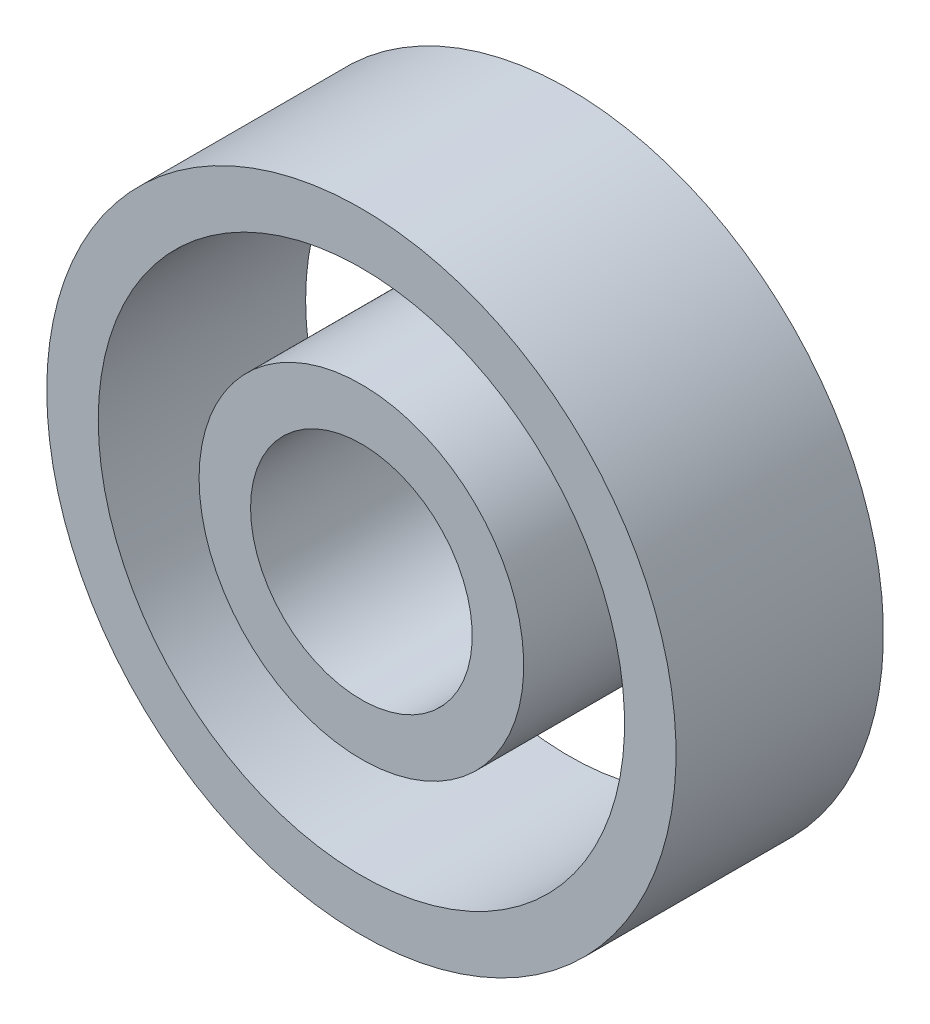
ISO-10303-21;
HEADER;
FILE_DESCRIPTION(('STEP AP214'),'2;1');
FILE_NAME('part.step','',(''),(''),'','','');
FILE_SCHEMA(('AUTOMOTIVE_DESIGN { 1 0 10303 214 1 1 1 1 }'));
ENDSEC;
DATA;
#1=APPLICATION_CONTEXT('core data for automotive mechanical design processes');
#2=APPLICATION_PROTOCOL_DEFINITION('international standard','automotive_design',2000,#1);
#3=PRODUCT_CONTEXT('',#1,'mechanical');
#4=PRODUCT('Part','Part','',(#3));
#5=PRODUCT_RELATED_PRODUCT_CATEGORY('part','',(#4));
#6=PRODUCT_DEFINITION_FORMATION('','',#4);
#7=PRODUCT_DEFINITION_CONTEXT('part definition',#1,'design');
#8=PRODUCT_DEFINITION('design','',#6,#7);
#9=PRODUCT_DEFINITION_SHAPE('','',#8);
#10=(LENGTH_UNIT() NAMED_UNIT(*) SI_UNIT(.MILLI.,.METRE.));
#11=(NAMED_UNIT(*) PLANE_ANGLE_UNIT() SI_UNIT($,.RADIAN.));
#12=(NAMED_UNIT(*) SI_UNIT($,.STERADIAN.) SOLID_ANGLE_UNIT());
#13=UNCERTAINTY_MEASURE_WITH_UNIT(LENGTH_MEASURE(1.E-05),#10,'distance_accuracy_value','');
#14=(GEOMETRIC_REPRESENTATION_CONTEXT(3) GLOBAL_UNCERTAINTY_ASSIGNED_CONTEXT((#13)) GLOBAL_UNIT_ASSIGNED_CONTEXT((#10,
#11,#12)) REPRESENTATION_CONTEXT('',''));
#15=CARTESIAN_POINT('',(0.,0.,0.));
#16=DIRECTION('',(0.,0.,1.));
#17=DIRECTION('',(1.,0.,0.));
#18=AXIS2_PLACEMENT_3D('',#15,#16,#17);
#19=CARTESIAN_POINT('',(0.,0.,7.25));
#20=DIRECTION('',(0.,0.,-1.));
#21=DIRECTION('',(-1.,0.,0.));
#22=AXIS2_PLACEMENT_3D('',#19,#20,#21);
#23=CYLINDRICAL_SURFACE('',#22,3.875);
#24=CARTESIAN_POINT('',(0.,0.,7.25));
#25=DIRECTION('',(0.,0.,1.));
#26=DIRECTION('',(1.,0.,0.));
#27=AXIS2_PLACEMENT_3D('',#24,#25,#26);
#28=CIRCLE('',#27,3.875);
#29=CARTESIAN_POINT('',(-3.875,0.,7.25));
#30=VERTEX_POINT('',#29);
#31=EDGE_CURVE('E60',#30,#30,#28,.T.);
#32=CARTESIAN_POINT('',(0.,0.,0.));
#33=DIRECTION('',(0.,0.,1.));
#34=DIRECTION('',(1.,0.,0.));
#35=AXIS2_PLACEMENT_3D('',#32,#33,#34);
#36=CIRCLE('',#35,3.875);
#37=CARTESIAN_POINT('',(-3.875,0.,0.));
#38=VERTEX_POINT('',#37);
#39=EDGE_CURVE('E66',#38,#38,#36,.T.);
#40=CARTESIAN_POINT('',(-3.875,0.,7.25));
#41=CARTESIAN_POINT('',(-3.875,0.,7.17447916666667));
#42=CARTESIAN_POINT('',(-3.875,0.,7.09895833333333));
#43=CARTESIAN_POINT('',(-3.875,0.,6.94791666666667));
#44=CARTESIAN_POINT('',(-3.875,0.,6.87239583333333));
#45=CARTESIAN_POINT('',(-3.875,0.,6.72135416666667));
#46=CARTESIAN_POINT('',(-3.875,0.,6.64583333333333));
#47=CARTESIAN_POINT('',(-3.875,0.,6.49479166666667));
#48=CARTESIAN_POINT('',(-3.875,0.,6.41927083333333));
#49=CARTESIAN_POINT('',(-3.875,0.,6.26822916666667));
#50=CARTESIAN_POINT('',(-3.875,0.,6.19270833333333));
#51=CARTESIAN_POINT('',(-3.875,0.,6.04166666666667));
#52=CARTESIAN_POINT('',(-3.875,0.,5.96614583333333));
#53=CARTESIAN_POINT('',(-3.875,0.,5.81510416666667));
#54=CARTESIAN_POINT('',(-3.875,0.,5.73958333333333));
#55=CARTESIAN_POINT('',(-3.875,0.,5.58854166666667));
#56=CARTESIAN_POINT('',(-3.875,0.,5.51302083333333));
#57=CARTESIAN_POINT('',(-3.875,0.,5.36197916666667));
#58=CARTESIAN_POINT('',(-3.875,0.,5.28645833333333));
#59=CARTESIAN_POINT('',(-3.875,0.,5.13541666666667));
#60=CARTESIAN_POINT('',(-3.875,0.,5.05989583333333));
#61=CARTESIAN_POINT('',(-3.875,0.,4.90885416666667));
#62=CARTESIAN_POINT('',(-3.875,0.,4.83333333333333));
#63=CARTESIAN_POINT('',(-3.875,0.,4.68229166666667));
#64=CARTESIAN_POINT('',(-3.875,0.,4.60677083333333));
#65=CARTESIAN_POINT('',(-3.875,0.,4.45572916666667));
#66=CARTESIAN_POINT('',(-3.875,0.,4.38020833333333));
#67=CARTESIAN_POINT('',(-3.875,0.,4.22916666666667));
#68=CARTESIAN_POINT('',(-3.875,0.,4.15364583333333));
#69=CARTESIAN_POINT('',(-3.875,0.,4.00260416666667));
#70=CARTESIAN_POINT('',(-3.875,0.,3.92708333333333));
#71=CARTESIAN_POINT('',(-3.875,0.,3.77604166666667));
#72=CARTESIAN_POINT('',(-3.875,0.,3.70052083333333));
#73=CARTESIAN_POINT('',(-3.875,0.,3.54947916666667));
#74=CARTESIAN_POINT('',(-3.875,0.,3.47395833333333));
#75=CARTESIAN_POINT('',(-3.875,0.,3.32291666666667));
#76=CARTESIAN_POINT('',(-3.875,0.,3.24739583333333));
#77=CARTESIAN_POINT('',(-3.875,0.,3.09635416666667));
#78=CARTESIAN_POINT('',(-3.875,0.,3.02083333333333));
#79=CARTESIAN_POINT('',(-3.875,0.,2.86979166666667));
#80=CARTESIAN_POINT('',(-3.875,0.,2.79427083333333));
#81=CARTESIAN_POINT('',(-3.875,0.,2.64322916666667));
#82=CARTESIAN_POINT('',(-3.875,0.,2.56770833333333));
#83=CARTESIAN_POINT('',(-3.875,0.,2.41666666666667));
#84=CARTESIAN_POINT('',(-3.875,0.,2.34114583333333));
#85=CARTESIAN_POINT('',(-3.875,0.,2.19010416666667));
#86=CARTESIAN_POINT('',(-3.875,0.,2.11458333333333));
#87=CARTESIAN_POINT('',(-3.875,0.,1.96354166666667));
#88=CARTESIAN_POINT('',(-3.875,0.,1.88802083333333));
#89=CARTESIAN_POINT('',(-3.875,0.,1.73697916666667));
#90=CARTESIAN_POINT('',(-3.875,0.,1.66145833333333));
#91=CARTESIAN_POINT('',(-3.875,0.,1.51041666666667));
#92=CARTESIAN_POINT('',(-3.875,0.,1.43489583333333));
#93=CARTESIAN_POINT('',(-3.875,0.,1.28385416666667));
#94=CARTESIAN_POINT('',(-3.875,0.,1.20833333333333));
#95=CARTESIAN_POINT('',(-3.875,0.,1.05729166666667));
#96=CARTESIAN_POINT('',(-3.875,0.,0.981770833333333));
#97=CARTESIAN_POINT('',(-3.875,0.,0.830729166666667));
#98=CARTESIAN_POINT('',(-3.875,0.,0.755208333333333));
#99=CARTESIAN_POINT('',(-3.875,0.,0.604166666666667));
#100=CARTESIAN_POINT('',(-3.875,0.,0.528645833333333));
#101=CARTESIAN_POINT('',(-3.875,0.,0.377604166666667));
#102=CARTESIAN_POINT('',(-3.875,0.,0.302083333333334));
#103=CARTESIAN_POINT('',(-3.875,0.,0.151041666666667));
#104=CARTESIAN_POINT('',(-3.875,0.,0.0755208333333333));
#105=CARTESIAN_POINT('',(-3.875,0.,0.));
#106=B_SPLINE_CURVE_WITH_KNOTS('',3,(#40,#41,#42,#43,#44,#45,#46,#47,#48,#49,#50,#51,#52,#53,
#54,#55,#56,#57,#58,#59,#60,#61,#62,#63,#64,#65,#66,#67,#68,#69,#70,#71,#72,#73,#74,#75,#76,#77,
#78,#79,#80,#81,#82,#83,#84,#85,#86,#87,#88,#89,#90,#91,#92,#93,#94,#95,#96,#97,#98,#99,#100,
#101,#102,#103,#104,#105),.UNSPECIFIED.,.F.,.F.,(4,2,2,2,2,2,2,2,2,2,2,2,2,2,2,2,2,2,2,2,2,2,2,
2,2,2,2,2,2,2,2,2,4),(0.,0.226562499999999,0.453125,0.6796875,0.906249999999999,1.1328125,
1.359375,1.5859375,1.8125,2.0390625,2.265625,2.4921875,2.71875,2.9453125,3.171875,3.3984375,
3.625,3.8515625,4.078125,4.3046875,4.53125,4.7578125,4.984375,5.2109375,5.4375,5.6640625,
5.890625,6.1171875,6.34375,6.5703125,6.796875,7.0234375,7.25),.UNSPECIFIED.);
#107=EDGE_CURVE('BSEAM53',#30,#38,#106,.T.);
#108=ORIENTED_EDGE('',*,*,#31,.T.);
#109=ORIENTED_EDGE('',*,*,#39,.F.);
#110=ORIENTED_EDGE('',*,*,#107,.T.);
#111=ORIENTED_EDGE('',*,*,#107,.F.);
#112=EDGE_LOOP('',(#108,#110,#109,#111));
#113=FACE_BOUND('',#112,.T.);
#114=ADVANCED_FACE('F53',(#113),#23,.F.);
#115=CARTESIAN_POINT('',(0.,0.,7.25));
#116=DIRECTION('',(0.,0.,-1.));
#117=DIRECTION('',(-1.,0.,0.));
#118=AXIS2_PLACEMENT_3D('',#115,#116,#117);
#119=CYLINDRICAL_SURFACE('',#118,5.675);
#120=CARTESIAN_POINT('',(0.,0.,7.25));
#121=DIRECTION('',(0.,0.,1.));
#122=DIRECTION('',(1.,0.,0.));
#123=AXIS2_PLACEMENT_3D('',#120,#121,#122);
#124=CIRCLE('',#123,5.675);
#125=CARTESIAN_POINT('',(-5.675,0.,7.25));
#126=VERTEX_POINT('',#125);
#127=EDGE_CURVE('E12',#126,#126,#124,.T.);
#128=CARTESIAN_POINT('',(0.,0.,0.));
#129=DIRECTION('',(0.,0.,1.));
#130=DIRECTION('',(1.,0.,0.));
#131=AXIS2_PLACEMENT_3D('',#128,#129,#130);
#132=CIRCLE('',#131,5.675);
#133=CARTESIAN_POINT('',(-5.675,0.,0.));
#134=VERTEX_POINT('',#133);
#135=EDGE_CURVE('E56',#134,#134,#132,.T.);
#136=CARTESIAN_POINT('',(-5.675,0.,7.25));
#137=CARTESIAN_POINT('',(-5.675,0.,7.17447916666667));
#138=CARTESIAN_POINT('',(-5.675,0.,7.09895833333333));
#139=CARTESIAN_POINT('',(-5.675,0.,6.94791666666667));
#140=CARTESIAN_POINT('',(-5.675,0.,6.87239583333333));
#141=CARTESIAN_POINT('',(-5.675,0.,6.72135416666667));
#142=CARTESIAN_POINT('',(-5.675,0.,6.64583333333333));
#143=CARTESIAN_POINT('',(-5.675,0.,6.49479166666667));
#144=CARTESIAN_POINT('',(-5.675,0.,6.41927083333333));
#145=CARTESIAN_POINT('',(-5.675,0.,6.26822916666667));
#146=CARTESIAN_POINT('',(-5.675,0.,6.19270833333333));
#147=CARTESIAN_POINT('',(-5.675,0.,6.04166666666667));
#148=CARTESIAN_POINT('',(-5.675,0.,5.96614583333333));
#149=CARTESIAN_POINT('',(-5.675,0.,5.81510416666667));
#150=CARTESIAN_POINT('',(-5.675,0.,5.73958333333333));
#151=CARTESIAN_POINT('',(-5.675,0.,5.58854166666667));
#152=CARTESIAN_POINT('',(-5.675,0.,5.51302083333333));
#153=CARTESIAN_POINT('',(-5.675,0.,5.36197916666667));
#154=CARTESIAN_POINT('',(-5.675,0.,5.28645833333333));
#155=CARTESIAN_POINT('',(-5.675,0.,5.13541666666667));
#156=CARTESIAN_POINT('',(-5.675,0.,5.05989583333333));
#157=CARTESIAN_POINT('',(-5.675,0.,4.90885416666667));
#158=CARTESIAN_POINT('',(-5.675,0.,4.83333333333333));
#159=CARTESIAN_POINT('',(-5.675,0.,4.68229166666667));
#160=CARTESIAN_POINT('',(-5.675,0.,4.60677083333333));
#161=CARTESIAN_POINT('',(-5.675,0.,4.45572916666667));
#162=CARTESIAN_POINT('',(-5.675,0.,4.38020833333333));
#163=CARTESIAN_POINT('',(-5.675,0.,4.22916666666667));
#164=CARTESIAN_POINT('',(-5.675,0.,4.15364583333333));
#165=CARTESIAN_POINT('',(-5.675,0.,4.00260416666667));
#166=CARTESIAN_POINT('',(-5.675,0.,3.92708333333333));
#167=CARTESIAN_POINT('',(-5.675,0.,3.77604166666667));
#168=CARTESIAN_POINT('',(-5.675,0.,3.70052083333333));
#169=CARTESIAN_POINT('',(-5.675,0.,3.54947916666667));
#170=CARTESIAN_POINT('',(-5.675,0.,3.47395833333333));
#171=CARTESIAN_POINT('',(-5.675,0.,3.32291666666667));
#172=CARTESIAN_POINT('',(-5.675,0.,3.24739583333333));
#173=CARTESIAN_POINT('',(-5.675,0.,3.09635416666667));
#174=CARTESIAN_POINT('',(-5.675,0.,3.02083333333333));
#175=CARTESIAN_POINT('',(-5.675,0.,2.86979166666667));
#176=CARTESIAN_POINT('',(-5.675,0.,2.79427083333333));
#177=CARTESIAN_POINT('',(-5.675,0.,2.64322916666667));
#178=CARTESIAN_POINT('',(-5.675,0.,2.56770833333333));
#179=CARTESIAN_POINT('',(-5.675,0.,2.41666666666667));
#180=CARTESIAN_POINT('',(-5.675,0.,2.34114583333333));
#181=CARTESIAN_POINT('',(-5.675,0.,2.19010416666667));
#182=CARTESIAN_POINT('',(-5.675,0.,2.11458333333333));
#183=CARTESIAN_POINT('',(-5.675,0.,1.96354166666667));
#184=CARTESIAN_POINT('',(-5.675,0.,1.88802083333333));
#185=CARTESIAN_POINT('',(-5.675,0.,1.73697916666667));
#186=CARTESIAN_POINT('',(-5.675,0.,1.66145833333333));
#187=CARTESIAN_POINT('',(-5.675,0.,1.51041666666667));
#188=CARTESIAN_POINT('',(-5.675,0.,1.43489583333333));
#189=CARTESIAN_POINT('',(-5.675,0.,1.28385416666667));
#190=CARTESIAN_POINT('',(-5.675,0.,1.20833333333333));
#191=CARTESIAN_POINT('',(-5.675,0.,1.05729166666667));
#192=CARTESIAN_POINT('',(-5.675,0.,0.981770833333333));
#193=CARTESIAN_POINT('',(-5.675,0.,0.830729166666667));
#194=CARTESIAN_POINT('',(-5.675,0.,0.755208333333333));
#195=CARTESIAN_POINT('',(-5.675,0.,0.604166666666667));
#196=CARTESIAN_POINT('',(-5.675,0.,0.528645833333333));
#197=CARTESIAN_POINT('',(-5.675,0.,0.377604166666667));
#198=CARTESIAN_POINT('',(-5.675,0.,0.302083333333334));
#199=CARTESIAN_POINT('',(-5.675,0.,0.151041666666667));
#200=CARTESIAN_POINT('',(-5.675,0.,0.0755208333333333));
#201=CARTESIAN_POINT('',(-5.675,0.,0.));
#202=B_SPLINE_CURVE_WITH_KNOTS('',3,(#136,#137,#138,#139,#140,#141,#142,#143,#144,#145,#146,
#147,#148,#149,#150,#151,#152,#153,#154,#155,#156,#157,#158,#159,#160,#161,#162,#163,#164,#165,
#166,#167,#168,#169,#170,#171,#172,#173,#174,#175,#176,#177,#178,#179,#180,#181,#182,#183,#184,
#185,#186,#187,#188,#189,#190,#191,#192,#193,#194,#195,#196,#197,#198,#199,#200,#201),
.UNSPECIFIED.,.F.,.F.,(4,2,2,2,2,2,2,2,2,2,2,2,2,2,2,2,2,2,2,2,2,2,2,2,2,2,2,2,2,2,2,2,4),(0.,
0.226562499999999,0.453125,0.6796875,0.906249999999999,1.1328125,1.359375,1.5859375,1.8125,
2.0390625,2.265625,2.4921875,2.71875,2.9453125,3.171875,3.3984375,3.625,3.8515625,4.078125,
4.3046875,4.53125,4.7578125,4.984375,5.2109375,5.4375,5.6640625,5.890625,6.1171875,6.34375,
6.5703125,6.796875,7.0234375,7.25),.UNSPECIFIED.);
#203=EDGE_CURVE('BSEAM73',#126,#134,#202,.T.);
#204=ORIENTED_EDGE('',*,*,#127,.F.);
#205=ORIENTED_EDGE('',*,*,#135,.T.);
#206=ORIENTED_EDGE('',*,*,#203,.T.);
#207=ORIENTED_EDGE('',*,*,#203,.F.);
#208=EDGE_LOOP('',(#204,#206,#205,#207));
#209=FACE_BOUND('',#208,.T.);
#210=ADVANCED_FACE('F73',(#209),#119,.T.);
#211=CARTESIAN_POINT('',(0.,0.,7.25));
#212=DIRECTION('',(0.,0.,1.));
#213=DIRECTION('',(1.,0.,0.));
#214=AXIS2_PLACEMENT_3D('',#211,#212,#213);
#215=PLANE('',#214);
#216=ORIENTED_EDGE('',*,*,#31,.F.);
#217=EDGE_LOOP('',(#216));
#218=FACE_BOUND('',#217,.T.);
#219=ORIENTED_EDGE('',*,*,#127,.T.);
#220=EDGE_LOOP('',(#219));
#221=FACE_BOUND('',#220,.T.);
#222=ADVANCED_FACE('F77',(#218,#221),#215,.T.);
#223=CARTESIAN_POINT('',(0.,0.,0.));
#224=DIRECTION('',(0.,0.,1.));
#225=DIRECTION('',(1.,0.,0.));
#226=AXIS2_PLACEMENT_3D('',#223,#224,#225);
#227=PLANE('',#226);
#228=ORIENTED_EDGE('',*,*,#39,.T.);
#229=EDGE_LOOP('',(#228));
#230=FACE_BOUND('',#229,.T.);
#231=ORIENTED_EDGE('',*,*,#135,.F.);
#232=EDGE_LOOP('',(#231));
#233=FACE_BOUND('',#232,.T.);
#234=ADVANCED_FACE('F75',(#230,#233),#227,.F.);
#235=CLOSED_SHELL('',(#114,#210,#222,#234));
#236=MANIFOLD_SOLID_BREP('B2',#235);
#237=CARTESIAN_POINT('',(0.,0.,7.25));
#238=DIRECTION('',(0.,0.,-1.));
#239=DIRECTION('',(-1.,0.,0.));
#240=AXIS2_PLACEMENT_3D('',#237,#238,#239);
#241=CYLINDRICAL_SURFACE('',#240,9.2);
#242=CARTESIAN_POINT('',(0.,0.,7.25));
#243=DIRECTION('',(0.,0.,1.));
#244=DIRECTION('',(1.,0.,0.));
#245=AXIS2_PLACEMENT_3D('',#242,#243,#244);
#246=CIRCLE('',#245,9.2);
#247=CARTESIAN_POINT('',(-9.2,0.,7.25));
#248=VERTEX_POINT('',#247);
#249=EDGE_CURVE('E123',#248,#248,#246,.T.);
#250=CARTESIAN_POINT('',(0.,0.,0.));
#251=DIRECTION('',(0.,0.,1.));
#252=DIRECTION('',(1.,0.,0.));
#253=AXIS2_PLACEMENT_3D('',#250,#251,#252);
#254=CIRCLE('',#253,9.2);
#255=CARTESIAN_POINT('',(-9.2,0.,0.));
#256=VERTEX_POINT('',#255);
#257=EDGE_CURVE('E130',#256,#256,#254,.T.);
#258=CARTESIAN_POINT('',(-9.2,0.,7.25));
#259=CARTESIAN_POINT('',(-9.2,0.,7.17447916666667));
#260=CARTESIAN_POINT('',(-9.2,0.,7.09895833333333));
#261=CARTESIAN_POINT('',(-9.2,0.,6.94791666666667));
#262=CARTESIAN_POINT('',(-9.2,0.,6.87239583333333));
#263=CARTESIAN_POINT('',(-9.2,0.,6.72135416666667));
#264=CARTESIAN_POINT('',(-9.2,0.,6.64583333333333));
#265=CARTESIAN_POINT('',(-9.2,0.,6.49479166666667));
#266=CARTESIAN_POINT('',(-9.2,0.,6.41927083333333));
#267=CARTESIAN_POINT('',(-9.2,0.,6.26822916666667));
#268=CARTESIAN_POINT('',(-9.2,0.,6.19270833333333));
#269=CARTESIAN_POINT('',(-9.2,0.,6.04166666666667));
#270=CARTESIAN_POINT('',(-9.2,0.,5.96614583333333));
#271=CARTESIAN_POINT('',(-9.2,0.,5.81510416666667));
#272=CARTESIAN_POINT('',(-9.2,0.,5.73958333333333));
#273=CARTESIAN_POINT('',(-9.2,0.,5.58854166666667));
#274=CARTESIAN_POINT('',(-9.2,0.,5.51302083333333));
#275=CARTESIAN_POINT('',(-9.2,0.,5.36197916666667));
#276=CARTESIAN_POINT('',(-9.2,0.,5.28645833333333));
#277=CARTESIAN_POINT('',(-9.2,0.,5.13541666666667));
#278=CARTESIAN_POINT('',(-9.2,0.,5.05989583333333));
#279=CARTESIAN_POINT('',(-9.2,0.,4.90885416666667));
#280=CARTESIAN_POINT('',(-9.2,0.,4.83333333333333));
#281=CARTESIAN_POINT('',(-9.2,0.,4.68229166666667));
#282=CARTESIAN_POINT('',(-9.2,0.,4.60677083333333));
#283=CARTESIAN_POINT('',(-9.2,0.,4.45572916666667));
#284=CARTESIAN_POINT('',(-9.2,0.,4.38020833333333));
#285=CARTESIAN_POINT('',(-9.2,0.,4.22916666666667));
#286=CARTESIAN_POINT('',(-9.2,0.,4.15364583333333));
#287=CARTESIAN_POINT('',(-9.2,0.,4.00260416666667));
#288=CARTESIAN_POINT('',(-9.2,0.,3.92708333333333));
#289=CARTESIAN_POINT('',(-9.2,0.,3.77604166666667));
#290=CARTESIAN_POINT('',(-9.2,0.,3.70052083333333));
#291=CARTESIAN_POINT('',(-9.2,0.,3.54947916666667));
#292=CARTESIAN_POINT('',(-9.2,0.,3.47395833333333));
#293=CARTESIAN_POINT('',(-9.2,0.,3.32291666666667));
#294=CARTESIAN_POINT('',(-9.2,0.,3.24739583333333));
#295=CARTESIAN_POINT('',(-9.2,0.,3.09635416666667));
#296=CARTESIAN_POINT('',(-9.2,0.,3.02083333333333));
#297=CARTESIAN_POINT('',(-9.2,0.,2.86979166666667));
#298=CARTESIAN_POINT('',(-9.2,0.,2.79427083333333));
#299=CARTESIAN_POINT('',(-9.2,0.,2.64322916666667));
#300=CARTESIAN_POINT('',(-9.2,0.,2.56770833333333));
#301=CARTESIAN_POINT('',(-9.2,0.,2.41666666666667));
#302=CARTESIAN_POINT('',(-9.2,0.,2.34114583333333));
#303=CARTESIAN_POINT('',(-9.2,0.,2.19010416666667));
#304=CARTESIAN_POINT('',(-9.2,0.,2.11458333333333));
#305=CARTESIAN_POINT('',(-9.2,0.,1.96354166666667));
#306=CARTESIAN_POINT('',(-9.2,0.,1.88802083333333));
#307=CARTESIAN_POINT('',(-9.2,0.,1.73697916666667));
#308=CARTESIAN_POINT('',(-9.2,0.,1.66145833333333));
#309=CARTESIAN_POINT('',(-9.2,0.,1.51041666666667));
#310=CARTESIAN_POINT('',(-9.2,0.,1.43489583333333));
#311=CARTESIAN_POINT('',(-9.2,0.,1.28385416666667));
#312=CARTESIAN_POINT('',(-9.2,0.,1.20833333333333));
#313=CARTESIAN_POINT('',(-9.2,0.,1.05729166666667));
#314=CARTESIAN_POINT('',(-9.2,0.,0.981770833333333));
#315=CARTESIAN_POINT('',(-9.2,0.,0.830729166666667));
#316=CARTESIAN_POINT('',(-9.2,0.,0.755208333333333));
#317=CARTESIAN_POINT('',(-9.2,0.,0.604166666666667));
#318=CARTESIAN_POINT('',(-9.2,0.,0.528645833333333));
#319=CARTESIAN_POINT('',(-9.2,0.,0.377604166666667));
#320=CARTESIAN_POINT('',(-9.2,0.,0.302083333333334));
#321=CARTESIAN_POINT('',(-9.2,0.,0.151041666666667));
#322=CARTESIAN_POINT('',(-9.2,0.,0.0755208333333333));
#323=CARTESIAN_POINT('',(-9.2,0.,0.));
#324=B_SPLINE_CURVE_WITH_KNOTS('',3,(#258,#259,#260,#261,#262,#263,#264,#265,#266,#267,#268,
#269,#270,#271,#272,#273,#274,#275,#276,#277,#278,#279,#280,#281,#282,#283,#284,#285,#286,#287,
#288,#289,#290,#291,#292,#293,#294,#295,#296,#297,#298,#299,#300,#301,#302,#303,#304,#305,#306,
#307,#308,#309,#310,#311,#312,#313,#314,#315,#316,#317,#318,#319,#320,#321,#322,#323),
.UNSPECIFIED.,.F.,.F.,(4,2,2,2,2,2,2,2,2,2,2,2,2,2,2,2,2,2,2,2,2,2,2,2,2,2,2,2,2,2,2,2,4),(0.,
0.226562499999999,0.453125,0.6796875,0.906249999999999,1.1328125,1.359375,1.5859375,1.8125,
2.0390625,2.265625,2.4921875,2.71875,2.9453125,3.171875,3.3984375,3.625,3.8515625,4.078125,
4.3046875,4.53125,4.7578125,4.984375,5.2109375,5.4375,5.6640625,5.890625,6.1171875,6.34375,
6.5703125,6.796875,7.0234375,7.25),.UNSPECIFIED.);
#325=EDGE_CURVE('BSEAM115',#248,#256,#324,.T.);
#326=ORIENTED_EDGE('',*,*,#249,.T.);
#327=ORIENTED_EDGE('',*,*,#257,.F.);
#328=ORIENTED_EDGE('',*,*,#325,.T.);
#329=ORIENTED_EDGE('',*,*,#325,.F.);
#330=EDGE_LOOP('',(#326,#328,#327,#329));
#331=FACE_BOUND('',#330,.T.);
#332=ADVANCED_FACE('F115',(#331),#241,.F.);
#333=CARTESIAN_POINT('',(0.,0.,7.25));
#334=DIRECTION('',(0.,0.,-1.));
#335=DIRECTION('',(-1.,0.,0.));
#336=AXIS2_PLACEMENT_3D('',#333,#334,#335);
#337=CYLINDRICAL_SURFACE('',#336,11.);
#338=CARTESIAN_POINT('',(0.,0.,7.25));
#339=DIRECTION('',(0.,0.,1.));
#340=DIRECTION('',(1.,0.,0.));
#341=AXIS2_PLACEMENT_3D('',#338,#339,#340);
#342=CIRCLE('',#341,11.);
#343=CARTESIAN_POINT('',(-11.,0.,7.25));
#344=VERTEX_POINT('',#343);
#345=EDGE_CURVE('E52',#344,#344,#342,.T.);
#346=CARTESIAN_POINT('',(0.,0.,0.));
#347=DIRECTION('',(0.,0.,1.));
#348=DIRECTION('',(1.,0.,0.));
#349=AXIS2_PLACEMENT_3D('',#346,#347,#348);
#350=CIRCLE('',#349,11.);
#351=CARTESIAN_POINT('',(-11.,0.,0.));
#352=VERTEX_POINT('',#351);
#353=EDGE_CURVE('E118',#352,#352,#350,.T.);
#354=CARTESIAN_POINT('',(-11.,0.,7.25));
#355=CARTESIAN_POINT('',(-11.,0.,7.17447916666667));
#356=CARTESIAN_POINT('',(-11.,0.,7.09895833333333));
#357=CARTESIAN_POINT('',(-11.,0.,6.94791666666667));
#358=CARTESIAN_POINT('',(-11.,0.,6.87239583333333));
#359=CARTESIAN_POINT('',(-11.,0.,6.72135416666667));
#360=CARTESIAN_POINT('',(-11.,0.,6.64583333333333));
#361=CARTESIAN_POINT('',(-11.,0.,6.49479166666667));
#362=CARTESIAN_POINT('',(-11.,0.,6.41927083333333));
#363=CARTESIAN_POINT('',(-11.,0.,6.26822916666667));
#364=CARTESIAN_POINT('',(-11.,0.,6.19270833333333));
#365=CARTESIAN_POINT('',(-11.,0.,6.04166666666667));
#366=CARTESIAN_POINT('',(-11.,0.,5.96614583333333));
#367=CARTESIAN_POINT('',(-11.,0.,5.81510416666667));
#368=CARTESIAN_POINT('',(-11.,0.,5.73958333333333));
#369=CARTESIAN_POINT('',(-11.,0.,5.58854166666667));
#370=CARTESIAN_POINT('',(-11.,0.,5.51302083333333));
#371=CARTESIAN_POINT('',(-11.,0.,5.36197916666667));
#372=CARTESIAN_POINT('',(-11.,0.,5.28645833333333));
#373=CARTESIAN_POINT('',(-11.,0.,5.13541666666667));
#374=CARTESIAN_POINT('',(-11.,0.,5.05989583333333));
#375=CARTESIAN_POINT('',(-11.,0.,4.90885416666667));
#376=CARTESIAN_POINT('',(-11.,0.,4.83333333333333));
#377=CARTESIAN_POINT('',(-11.,0.,4.68229166666667));
#378=CARTESIAN_POINT('',(-11.,0.,4.60677083333333));
#379=CARTESIAN_POINT('',(-11.,0.,4.45572916666667));
#380=CARTESIAN_POINT('',(-11.,0.,4.38020833333333));
#381=CARTESIAN_POINT('',(-11.,0.,4.22916666666667));
#382=CARTESIAN_POINT('',(-11.,0.,4.15364583333333));
#383=CARTESIAN_POINT('',(-11.,0.,4.00260416666667));
#384=CARTESIAN_POINT('',(-11.,0.,3.92708333333333));
#385=CARTESIAN_POINT('',(-11.,0.,3.77604166666667));
#386=CARTESIAN_POINT('',(-11.,0.,3.70052083333333));
#387=CARTESIAN_POINT('',(-11.,0.,3.54947916666667));
#388=CARTESIAN_POINT('',(-11.,0.,3.47395833333333));
#389=CARTESIAN_POINT('',(-11.,0.,3.32291666666667));
#390=CARTESIAN_POINT('',(-11.,0.,3.24739583333333));
#391=CARTESIAN_POINT('',(-11.,0.,3.09635416666667));
#392=CARTESIAN_POINT('',(-11.,0.,3.02083333333333));
#393=CARTESIAN_POINT('',(-11.,0.,2.86979166666667));
#394=CARTESIAN_POINT('',(-11.,0.,2.79427083333333));
#395=CARTESIAN_POINT('',(-11.,0.,2.64322916666667));
#396=CARTESIAN_POINT('',(-11.,0.,2.56770833333333));
#397=CARTESIAN_POINT('',(-11.,0.,2.41666666666667));
#398=CARTESIAN_POINT('',(-11.,0.,2.34114583333333));
#399=CARTESIAN_POINT('',(-11.,0.,2.19010416666667));
#400=CARTESIAN_POINT('',(-11.,0.,2.11458333333333));
#401=CARTESIAN_POINT('',(-11.,0.,1.96354166666667));
#402=CARTESIAN_POINT('',(-11.,0.,1.88802083333333));
#403=CARTESIAN_POINT('',(-11.,0.,1.73697916666667));
#404=CARTESIAN_POINT('',(-11.,0.,1.66145833333333));
#405=CARTESIAN_POINT('',(-11.,0.,1.51041666666667));
#406=CARTESIAN_POINT('',(-11.,0.,1.43489583333333));
#407=CARTESIAN_POINT('',(-11.,0.,1.28385416666667));
#408=CARTESIAN_POINT('',(-11.,0.,1.20833333333333));
#409=CARTESIAN_POINT('',(-11.,0.,1.05729166666667));
#410=CARTESIAN_POINT('',(-11.,0.,0.981770833333333));
#411=CARTESIAN_POINT('',(-11.,0.,0.830729166666667));
#412=CARTESIAN_POINT('',(-11.,0.,0.755208333333333));
#413=CARTESIAN_POINT('',(-11.,0.,0.604166666666667));
#414=CARTESIAN_POINT('',(-11.,0.,0.528645833333333));
#415=CARTESIAN_POINT('',(-11.,0.,0.377604166666667));
#416=CARTESIAN_POINT('',(-11.,0.,0.302083333333334));
#417=CARTESIAN_POINT('',(-11.,0.,0.151041666666667));
#418=CARTESIAN_POINT('',(-11.,0.,0.0755208333333333));
#419=CARTESIAN_POINT('',(-11.,0.,0.));
#420=B_SPLINE_CURVE_WITH_KNOTS('',3,(#354,#355,#356,#357,#358,#359,#360,#361,#362,#363,#364,
#365,#366,#367,#368,#369,#370,#371,#372,#373,#374,#375,#376,#377,#378,#379,#380,#381,#382,#383,
#384,#385,#386,#387,#388,#389,#390,#391,#392,#393,#394,#395,#396,#397,#398,#399,#400,#401,#402,
#403,#404,#405,#406,#407,#408,#409,#410,#411,#412,#413,#414,#415,#416,#417,#418,#419),
.UNSPECIFIED.,.F.,.F.,(4,2,2,2,2,2,2,2,2,2,2,2,2,2,2,2,2,2,2,2,2,2,2,2,2,2,2,2,2,2,2,2,4),(0.,
0.226562499999999,0.453125,0.6796875,0.906249999999999,1.1328125,1.359375,1.5859375,1.8125,
2.0390625,2.265625,2.4921875,2.71875,2.9453125,3.171875,3.3984375,3.625,3.8515625,4.078125,
4.3046875,4.53125,4.7578125,4.984375,5.2109375,5.4375,5.6640625,5.890625,6.1171875,6.34375,
6.5703125,6.796875,7.0234375,7.25),.UNSPECIFIED.);
#421=EDGE_CURVE('BSEAM139',#344,#352,#420,.T.);
#422=ORIENTED_EDGE('',*,*,#345,.F.);
#423=ORIENTED_EDGE('',*,*,#353,.T.);
#424=ORIENTED_EDGE('',*,*,#421,.T.);
#425=ORIENTED_EDGE('',*,*,#421,.F.);
#426=EDGE_LOOP('',(#422,#424,#423,#425));
#427=FACE_BOUND('',#426,.T.);
#428=ADVANCED_FACE('F139',(#427),#337,.T.);
#429=CARTESIAN_POINT('',(0.,0.,7.25));
#430=DIRECTION('',(0.,0.,1.));
#431=DIRECTION('',(1.,0.,0.));
#432=AXIS2_PLACEMENT_3D('',#429,#430,#431);
#433=PLANE('',#432);
#434=ORIENTED_EDGE('',*,*,#249,.F.);
#435=EDGE_LOOP('',(#434));
#436=FACE_BOUND('',#435,.T.);
#437=ORIENTED_EDGE('',*,*,#345,.T.);
#438=EDGE_LOOP('',(#437));
#439=FACE_BOUND('',#438,.T.);
#440=ADVANCED_FACE('F143',(#436,#439),#433,.T.);
#441=CARTESIAN_POINT('',(0.,0.,0.));
#442=DIRECTION('',(0.,0.,1.));
#443=DIRECTION('',(1.,0.,0.));
#444=AXIS2_PLACEMENT_3D('',#441,#442,#443);
#445=PLANE('',#444);
#446=ORIENTED_EDGE('',*,*,#257,.T.);
#447=EDGE_LOOP('',(#446));
#448=FACE_BOUND('',#447,.T.);
#449=ORIENTED_EDGE('',*,*,#353,.F.);
#450=EDGE_LOOP('',(#449));
#451=FACE_BOUND('',#450,.T.);
#452=ADVANCED_FACE('F141',(#448,#451),#445,.F.);
#453=CLOSED_SHELL('',(#332,#428,#440,#452));
#454=MANIFOLD_SOLID_BREP('B7',#453);
#455=ADVANCED_BREP_SHAPE_REPRESENTATION('',(#18,#236,#454),#14);
#456=SHAPE_DEFINITION_REPRESENTATION(#9,#455);
ENDSEC;
END-ISO-10303-21;
